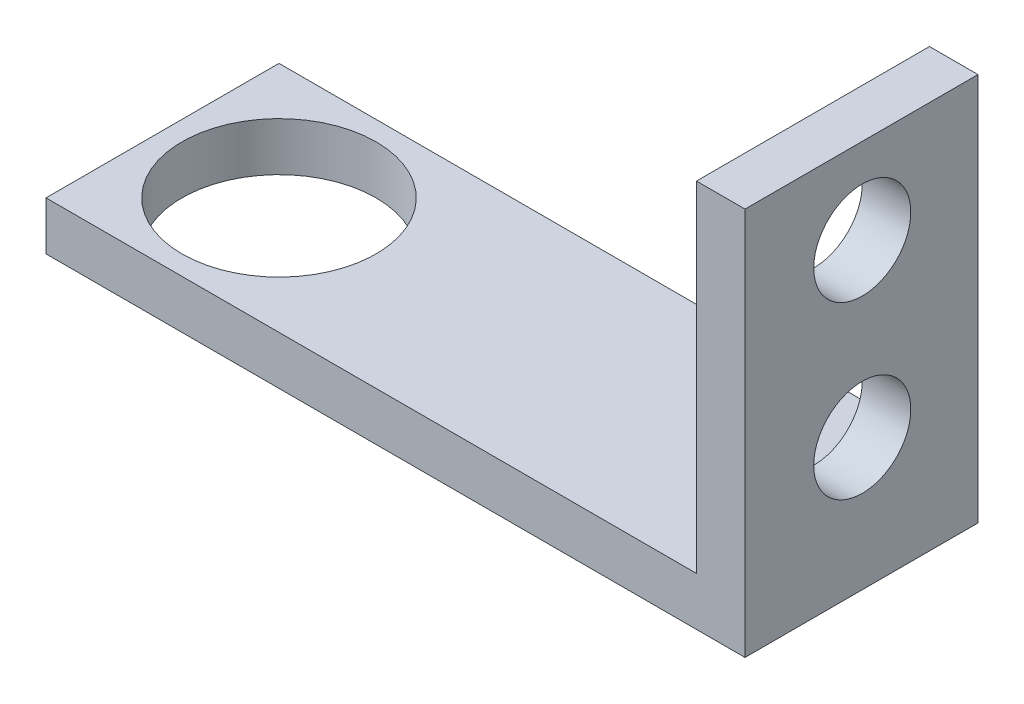
ISO-10303-21;
HEADER;
FILE_DESCRIPTION(('STEP AP214'),'2;1');
FILE_NAME('part.step','',(''),(''),'','','');
FILE_SCHEMA(('AUTOMOTIVE_DESIGN { 1 0 10303 214 1 1 1 1 }'));
ENDSEC;
DATA;
#1=APPLICATION_CONTEXT('core data for automotive mechanical design processes');
#2=APPLICATION_PROTOCOL_DEFINITION('international standard','automotive_design',2000,#1);
#3=PRODUCT_CONTEXT('',#1,'mechanical');
#4=PRODUCT('Part','Part','',(#3));
#5=PRODUCT_RELATED_PRODUCT_CATEGORY('part','',(#4));
#6=PRODUCT_DEFINITION_FORMATION('','',#4);
#7=PRODUCT_DEFINITION_CONTEXT('part definition',#1,'design');
#8=PRODUCT_DEFINITION('design','',#6,#7);
#9=PRODUCT_DEFINITION_SHAPE('','',#8);
#10=(LENGTH_UNIT() NAMED_UNIT(*) SI_UNIT(.MILLI.,.METRE.));
#11=(NAMED_UNIT(*) PLANE_ANGLE_UNIT() SI_UNIT($,.RADIAN.));
#12=(NAMED_UNIT(*) SI_UNIT($,.STERADIAN.) SOLID_ANGLE_UNIT());
#13=UNCERTAINTY_MEASURE_WITH_UNIT(LENGTH_MEASURE(1.E-05),#10,'distance_accuracy_value','');
#14=(GEOMETRIC_REPRESENTATION_CONTEXT(3) GLOBAL_UNCERTAINTY_ASSIGNED_CONTEXT((#13)) GLOBAL_UNIT_ASSIGNED_CONTEXT((#10,
#11,#12)) REPRESENTATION_CONTEXT('',''));
#15=CARTESIAN_POINT('',(0.,0.,0.));
#16=DIRECTION('',(0.,0.,1.));
#17=DIRECTION('',(1.,0.,0.));
#18=AXIS2_PLACEMENT_3D('',#15,#16,#17);
#19=CARTESIAN_POINT('',(0.,0.,0.));
#20=DIRECTION('',(0.,1.,0.));
#21=DIRECTION('',(0.,0.,1.));
#22=AXIS2_PLACEMENT_3D('',#19,#20,#21);
#23=PLANE('',#22);
#24=CARTESIAN_POINT('',(-19.05,0.,-3.81));
#25=DIRECTION('',(0.,-1.,0.));
#26=DIRECTION('',(0.,0.,-1.));
#27=AXIS2_PLACEMENT_3D('',#24,#25,#26);
#28=CIRCLE('',#27,3.17499999999999);
#29=CARTESIAN_POINT('',(-19.05,0.,-6.98499999999999));
#30=VERTEX_POINT('',#29);
#31=EDGE_CURVE('E157',#30,#30,#28,.T.);
#32=ORIENTED_EDGE('',*,*,#31,.F.);
#33=EDGE_LOOP('',(#32));
#34=FACE_BOUND('',#33,.T.);
#35=DIRECTION('',(0.,0.,1.));
#36=VECTOR('',#35,1.);
#37=CARTESIAN_POINT('',(-22.86,0.,-7.62));
#38=LINE('',#37,#36);
#39=CARTESIAN_POINT('',(-22.86,0.,-7.62));
#40=VERTEX_POINT('',#39);
#41=CARTESIAN_POINT('',(-22.86,0.,0.));
#42=VERTEX_POINT('',#41);
#43=EDGE_CURVE('E95',#40,#42,#38,.T.);
#44=ORIENTED_EDGE('',*,*,#43,.F.);
#45=DIRECTION('',(-1.,0.,0.));
#46=VECTOR('',#45,1.);
#47=CARTESIAN_POINT('',(0.,0.,-7.62));
#48=LINE('',#47,#46);
#49=CARTESIAN_POINT('',(0.,0.,-7.62));
#50=VERTEX_POINT('',#49);
#51=EDGE_CURVE('E115',#50,#40,#48,.T.);
#52=ORIENTED_EDGE('',*,*,#51,.F.);
#53=DIRECTION('',(0.,0.,-1.));
#54=VECTOR('',#53,1.);
#55=CARTESIAN_POINT('',(0.,0.,0.));
#56=LINE('',#55,#54);
#57=CARTESIAN_POINT('',(0.,0.,0.));
#58=VERTEX_POINT('',#57);
#59=EDGE_CURVE('E112',#58,#50,#56,.T.);
#60=ORIENTED_EDGE('',*,*,#59,.F.);
#61=DIRECTION('',(-1.,0.,0.));
#62=VECTOR('',#61,1.);
#63=CARTESIAN_POINT('',(0.,0.,0.));
#64=LINE('',#63,#62);
#65=EDGE_CURVE('E44',#58,#42,#64,.T.);
#66=ORIENTED_EDGE('',*,*,#65,.T.);
#67=EDGE_LOOP('',(#44,#52,#60,#66));
#68=FACE_BOUND('',#67,.T.);
#69=ADVANCED_FACE('F40',(#34,#68),#23,.F.);
#70=CARTESIAN_POINT('',(0.,1.5875,-7.62));
#71=DIRECTION('',(0.,0.,1.));
#72=DIRECTION('',(1.,0.,0.));
#73=AXIS2_PLACEMENT_3D('',#70,#71,#72);
#74=PLANE('',#73);
#75=DIRECTION('',(0.,-1.,0.));
#76=VECTOR('',#75,1.);
#77=CARTESIAN_POINT('',(-22.86,40.325157166359,-7.62));
#78=LINE('',#77,#76);
#79=CARTESIAN_POINT('',(-22.86,1.5875,-7.62));
#80=VERTEX_POINT('',#79);
#81=EDGE_CURVE('E97',#80,#40,#78,.T.);
#82=ORIENTED_EDGE('',*,*,#81,.F.);
#83=DIRECTION('',(-1.,0.,0.));
#84=VECTOR('',#83,1.);
#85=CARTESIAN_POINT('',(0.,1.5875,-7.62));
#86=LINE('',#85,#84);
#87=CARTESIAN_POINT('',(-1.5875,1.5875,-7.62));
#88=VERTEX_POINT('',#87);
#89=EDGE_CURVE('E50',#88,#80,#86,.T.);
#90=ORIENTED_EDGE('',*,*,#89,.F.);
#91=DIRECTION('',(0.,-1.,0.));
#92=VECTOR('',#91,1.);
#93=CARTESIAN_POINT('',(-1.5875,12.7,-7.62));
#94=LINE('',#93,#92);
#95=CARTESIAN_POINT('',(-1.5875,12.7,-7.62));
#96=VERTEX_POINT('',#95);
#97=EDGE_CURVE('E120',#96,#88,#94,.T.);
#98=ORIENTED_EDGE('',*,*,#97,.F.);
#99=DIRECTION('',(-1.,0.,0.));
#100=VECTOR('',#99,1.);
#101=CARTESIAN_POINT('',(0.,12.7,-7.62));
#102=LINE('',#101,#100);
#103=CARTESIAN_POINT('',(0.,12.7,-7.62));
#104=VERTEX_POINT('',#103);
#105=EDGE_CURVE('E140',#104,#96,#102,.T.);
#106=ORIENTED_EDGE('',*,*,#105,.F.);
#107=DIRECTION('',(0.,-1.,0.));
#108=VECTOR('',#107,1.);
#109=CARTESIAN_POINT('',(0.,12.7,-7.62));
#110=LINE('',#109,#108);
#111=EDGE_CURVE('E134',#104,#50,#110,.T.);
#112=ORIENTED_EDGE('',*,*,#111,.T.);
#113=ORIENTED_EDGE('',*,*,#51,.T.);
#114=EDGE_LOOP('',(#82,#90,#98,#106,#112,#113));
#115=FACE_BOUND('',#114,.T.);
#116=ADVANCED_FACE('F42',(#115),#74,.F.);
#117=CARTESIAN_POINT('',(0.,1.5875,0.));
#118=DIRECTION('',(0.,0.,1.));
#119=DIRECTION('',(1.,0.,0.));
#120=AXIS2_PLACEMENT_3D('',#117,#118,#119);
#121=PLANE('',#120);
#122=DIRECTION('',(-1.,0.,0.));
#123=VECTOR('',#122,1.);
#124=CARTESIAN_POINT('',(0.,1.5875,0.));
#125=LINE('',#124,#123);
#126=CARTESIAN_POINT('',(-1.5875,1.5875,0.));
#127=VERTEX_POINT('',#126);
#128=CARTESIAN_POINT('',(-22.86,1.5875,0.));
#129=VERTEX_POINT('',#128);
#130=EDGE_CURVE('E11',#127,#129,#125,.T.);
#131=ORIENTED_EDGE('',*,*,#130,.T.);
#132=DIRECTION('',(0.,-1.,0.));
#133=VECTOR('',#132,1.);
#134=CARTESIAN_POINT('',(-22.86,40.325157166359,0.));
#135=LINE('',#134,#133);
#136=EDGE_CURVE('E58',#129,#42,#135,.T.);
#137=ORIENTED_EDGE('',*,*,#136,.T.);
#138=ORIENTED_EDGE('',*,*,#65,.F.);
#139=DIRECTION('',(0.,-1.,0.));
#140=VECTOR('',#139,1.);
#141=CARTESIAN_POINT('',(0.,12.7,0.));
#142=LINE('',#141,#140);
#143=CARTESIAN_POINT('',(0.,12.7,0.));
#144=VERTEX_POINT('',#143);
#145=EDGE_CURVE('E131',#144,#58,#142,.T.);
#146=ORIENTED_EDGE('',*,*,#145,.F.);
#147=DIRECTION('',(-1.,0.,0.));
#148=VECTOR('',#147,1.);
#149=CARTESIAN_POINT('',(0.,12.7,0.));
#150=LINE('',#149,#148);
#151=CARTESIAN_POINT('',(-1.5875,12.7,0.));
#152=VERTEX_POINT('',#151);
#153=EDGE_CURVE('E144',#144,#152,#150,.T.);
#154=ORIENTED_EDGE('',*,*,#153,.T.);
#155=DIRECTION('',(0.,-1.,0.));
#156=VECTOR('',#155,1.);
#157=CARTESIAN_POINT('',(-1.5875,12.7,0.));
#158=LINE('',#157,#156);
#159=EDGE_CURVE('E124',#152,#127,#158,.T.);
#160=ORIENTED_EDGE('',*,*,#159,.T.);
#161=EDGE_LOOP('',(#131,#137,#138,#146,#154,#160));
#162=FACE_BOUND('',#161,.T.);
#163=ADVANCED_FACE('F105',(#162),#121,.T.);
#164=CARTESIAN_POINT('',(0.,1.5875,0.));
#165=DIRECTION('',(0.,1.,0.));
#166=DIRECTION('',(0.,0.,1.));
#167=AXIS2_PLACEMENT_3D('',#164,#165,#166);
#168=PLANE('',#167);
#169=CARTESIAN_POINT('',(-19.05,1.5875,-3.81));
#170=DIRECTION('',(0.,1.,0.));
#171=DIRECTION('',(0.,0.,1.));
#172=AXIS2_PLACEMENT_3D('',#169,#170,#171);
#173=CIRCLE('',#172,3.17499999999998);
#174=CARTESIAN_POINT('',(-19.05,1.5875,-0.635000000000016));
#175=VERTEX_POINT('',#174);
#176=EDGE_CURVE('E141',#175,#175,#173,.T.);
#177=ORIENTED_EDGE('',*,*,#176,.F.);
#178=EDGE_LOOP('',(#177));
#179=FACE_BOUND('',#178,.T.);
#180=ORIENTED_EDGE('',*,*,#89,.T.);
#181=DIRECTION('',(0.,0.,1.));
#182=VECTOR('',#181,1.);
#183=CARTESIAN_POINT('',(-22.86,1.5875,-7.62));
#184=LINE('',#183,#182);
#185=EDGE_CURVE('E161',#80,#129,#184,.T.);
#186=ORIENTED_EDGE('',*,*,#185,.T.);
#187=ORIENTED_EDGE('',*,*,#130,.F.);
#188=DIRECTION('',(0.,0.,1.));
#189=VECTOR('',#188,1.);
#190=CARTESIAN_POINT('',(-1.5875,1.5875,0.));
#191=LINE('',#190,#189);
#192=EDGE_CURVE('E114',#88,#127,#191,.T.);
#193=ORIENTED_EDGE('',*,*,#192,.F.);
#194=EDGE_LOOP('',(#180,#186,#187,#193));
#195=FACE_BOUND('',#194,.T.);
#196=ADVANCED_FACE('F188',(#179,#195),#168,.T.);
#197=CARTESIAN_POINT('',(-1.5875,12.7,0.));
#198=DIRECTION('',(1.,0.,0.));
#199=DIRECTION('',(0.,0.,-1.));
#200=AXIS2_PLACEMENT_3D('',#197,#198,#199);
#201=PLANE('',#200);
#202=CARTESIAN_POINT('',(-1.5875,9.906,-3.83467310056241));
#203=DIRECTION('',(-1.,0.,0.));
#204=DIRECTION('',(0.,0.,1.));
#205=AXIS2_PLACEMENT_3D('',#202,#203,#204);
#206=CIRCLE('',#205,1.58749999999998);
#207=CARTESIAN_POINT('',(-1.5875,9.906,-2.24717310056243));
#208=VERTEX_POINT('',#207);
#209=EDGE_CURVE('E177',#208,#208,#206,.T.);
#210=ORIENTED_EDGE('',*,*,#209,.F.);
#211=EDGE_LOOP('',(#210));
#212=FACE_BOUND('',#211,.T.);
#213=CARTESIAN_POINT('',(-1.5875,4.318,-3.83467310056241));
#214=DIRECTION('',(-1.,0.,0.));
#215=DIRECTION('',(0.,0.,1.));
#216=AXIS2_PLACEMENT_3D('',#213,#214,#215);
#217=CIRCLE('',#216,1.58749999999998);
#218=CARTESIAN_POINT('',(-1.5875,4.318,-2.24717310056243));
#219=VERTEX_POINT('',#218);
#220=EDGE_CURVE('E169',#219,#219,#217,.T.);
#221=ORIENTED_EDGE('',*,*,#220,.F.);
#222=EDGE_LOOP('',(#221));
#223=FACE_BOUND('',#222,.T.);
#224=ORIENTED_EDGE('',*,*,#97,.T.);
#225=ORIENTED_EDGE('',*,*,#192,.T.);
#226=ORIENTED_EDGE('',*,*,#159,.F.);
#227=DIRECTION('',(0.,0.,1.));
#228=VECTOR('',#227,1.);
#229=CARTESIAN_POINT('',(-1.5875,12.7,0.));
#230=LINE('',#229,#228);
#231=EDGE_CURVE('E148',#96,#152,#230,.T.);
#232=ORIENTED_EDGE('',*,*,#231,.F.);
#233=EDGE_LOOP('',(#224,#225,#226,#232));
#234=FACE_BOUND('',#233,.T.);
#235=ADVANCED_FACE('F184',(#212,#223,#234),#201,.F.);
#236=CARTESIAN_POINT('',(0.,12.7,0.));
#237=DIRECTION('',(-1.,0.,0.));
#238=DIRECTION('',(0.,0.,1.));
#239=AXIS2_PLACEMENT_3D('',#236,#237,#238);
#240=PLANE('',#239);
#241=CARTESIAN_POINT('',(0.,9.906,-3.83467310056241));
#242=DIRECTION('',(-1.,0.,0.));
#243=DIRECTION('',(0.,0.,1.));
#244=AXIS2_PLACEMENT_3D('',#241,#242,#243);
#245=CIRCLE('',#244,1.58749999999998);
#246=CARTESIAN_POINT('',(0.,9.906,-2.24717310056243));
#247=VERTEX_POINT('',#246);
#248=EDGE_CURVE('E173',#247,#247,#245,.T.);
#249=ORIENTED_EDGE('',*,*,#248,.T.);
#250=EDGE_LOOP('',(#249));
#251=FACE_BOUND('',#250,.T.);
#252=CARTESIAN_POINT('',(0.,4.318,-3.83467310056241));
#253=DIRECTION('',(-1.,0.,0.));
#254=DIRECTION('',(0.,0.,1.));
#255=AXIS2_PLACEMENT_3D('',#252,#253,#254);
#256=CIRCLE('',#255,1.58749999999998);
#257=CARTESIAN_POINT('',(0.,4.318,-2.24717310056243));
#258=VERTEX_POINT('',#257);
#259=EDGE_CURVE('E102',#258,#258,#256,.T.);
#260=ORIENTED_EDGE('',*,*,#259,.T.);
#261=EDGE_LOOP('',(#260));
#262=FACE_BOUND('',#261,.T.);
#263=ORIENTED_EDGE('',*,*,#59,.T.);
#264=ORIENTED_EDGE('',*,*,#111,.F.);
#265=DIRECTION('',(0.,0.,-1.));
#266=VECTOR('',#265,1.);
#267=CARTESIAN_POINT('',(0.,12.7,0.));
#268=LINE('',#267,#266);
#269=EDGE_CURVE('E137',#144,#104,#268,.T.);
#270=ORIENTED_EDGE('',*,*,#269,.F.);
#271=ORIENTED_EDGE('',*,*,#145,.T.);
#272=EDGE_LOOP('',(#263,#264,#270,#271));
#273=FACE_BOUND('',#272,.T.);
#274=ADVANCED_FACE('F187',(#251,#262,#273),#240,.F.);
#275=CARTESIAN_POINT('',(0.,12.7,0.));
#276=DIRECTION('',(0.,1.,0.));
#277=DIRECTION('',(0.,0.,1.));
#278=AXIS2_PLACEMENT_3D('',#275,#276,#277);
#279=PLANE('',#278);
#280=ORIENTED_EDGE('',*,*,#105,.T.);
#281=ORIENTED_EDGE('',*,*,#231,.T.);
#282=ORIENTED_EDGE('',*,*,#153,.F.);
#283=ORIENTED_EDGE('',*,*,#269,.T.);
#284=EDGE_LOOP('',(#280,#281,#282,#283));
#285=FACE_BOUND('',#284,.T.);
#286=ADVANCED_FACE('F196',(#285),#279,.T.);
#287=CARTESIAN_POINT('',(-19.05,0.,-3.81));
#288=DIRECTION('',(0.,-1.,0.));
#289=DIRECTION('',(0.,0.,-1.));
#290=AXIS2_PLACEMENT_3D('',#287,#288,#289);
#291=CYLINDRICAL_SURFACE('',#290,3.17499999999998);
#292=ORIENTED_EDGE('',*,*,#176,.T.);
#293=EDGE_LOOP('',(#292));
#294=FACE_BOUND('',#293,.T.);
#295=ORIENTED_EDGE('',*,*,#31,.T.);
#296=EDGE_LOOP('',(#295));
#297=FACE_BOUND('',#296,.T.);
#298=ADVANCED_FACE('F207',(#294,#297),#291,.F.);
#299=CARTESIAN_POINT('',(-22.86,40.325157166359,-7.62));
#300=DIRECTION('',(1.,0.,0.));
#301=DIRECTION('',(0.,0.,-1.));
#302=AXIS2_PLACEMENT_3D('',#299,#300,#301);
#303=PLANE('',#302);
#304=ORIENTED_EDGE('',*,*,#81,.T.);
#305=ORIENTED_EDGE('',*,*,#43,.T.);
#306=ORIENTED_EDGE('',*,*,#136,.F.);
#307=ORIENTED_EDGE('',*,*,#185,.F.);
#308=EDGE_LOOP('',(#304,#305,#306,#307));
#309=FACE_BOUND('',#308,.T.);
#310=ADVANCED_FACE('F96',(#309),#303,.F.);
#311=CARTESIAN_POINT('',(-1.5875,4.318,-3.83467310056241));
#312=DIRECTION('',(-1.,0.,0.));
#313=DIRECTION('',(0.,0.,1.));
#314=AXIS2_PLACEMENT_3D('',#311,#312,#313);
#315=CYLINDRICAL_SURFACE('',#314,1.58749999999998);
#316=ORIENTED_EDGE('',*,*,#259,.F.);
#317=EDGE_LOOP('',(#316));
#318=FACE_BOUND('',#317,.T.);
#319=ORIENTED_EDGE('',*,*,#220,.T.);
#320=EDGE_LOOP('',(#319));
#321=FACE_BOUND('',#320,.T.);
#322=ADVANCED_FACE('F235',(#318,#321),#315,.F.);
#323=CARTESIAN_POINT('',(-1.5875,9.906,-3.83467310056241));
#324=DIRECTION('',(-1.,0.,0.));
#325=DIRECTION('',(0.,0.,1.));
#326=AXIS2_PLACEMENT_3D('',#323,#324,#325);
#327=CYLINDRICAL_SURFACE('',#326,1.58749999999998);
#328=ORIENTED_EDGE('',*,*,#248,.F.);
#329=EDGE_LOOP('',(#328));
#330=FACE_BOUND('',#329,.T.);
#331=ORIENTED_EDGE('',*,*,#209,.T.);
#332=EDGE_LOOP('',(#331));
#333=FACE_BOUND('',#332,.T.);
#334=ADVANCED_FACE('F182',(#330,#333),#327,.F.);
#335=CLOSED_SHELL('',(#69,#116,#163,#196,#235,#274,#286,#298,#310,#322,#334));
#336=MANIFOLD_SOLID_BREP('B2',#335);
#337=ADVANCED_BREP_SHAPE_REPRESENTATION('',(#18,#336),#14);
#338=SHAPE_DEFINITION_REPRESENTATION(#9,#337);
ENDSEC;
END-ISO-10303-21;
